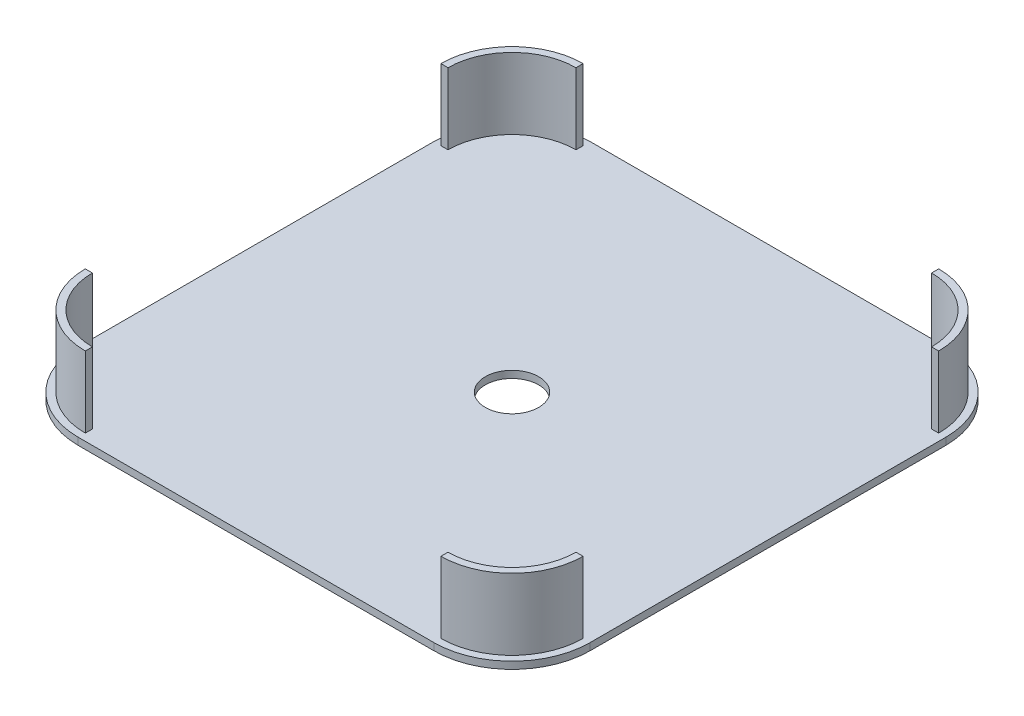
ISO-10303-21;
HEADER;
FILE_DESCRIPTION(('STEP AP214'),'2;1');
FILE_NAME('part.step','',(''),(''),'','','');
FILE_SCHEMA(('AUTOMOTIVE_DESIGN { 1 0 10303 214 1 1 1 1 }'));
ENDSEC;
DATA;
#1=APPLICATION_CONTEXT('core data for automotive mechanical design processes');
#2=APPLICATION_PROTOCOL_DEFINITION('international standard','automotive_design',2000,#1);
#3=PRODUCT_CONTEXT('',#1,'mechanical');
#4=PRODUCT('Part','Part','',(#3));
#5=PRODUCT_RELATED_PRODUCT_CATEGORY('part','',(#4));
#6=PRODUCT_DEFINITION_FORMATION('','',#4);
#7=PRODUCT_DEFINITION_CONTEXT('part definition',#1,'design');
#8=PRODUCT_DEFINITION('design','',#6,#7);
#9=PRODUCT_DEFINITION_SHAPE('','',#8);
#10=(LENGTH_UNIT() NAMED_UNIT(*) SI_UNIT(.MILLI.,.METRE.));
#11=(NAMED_UNIT(*) PLANE_ANGLE_UNIT() SI_UNIT($,.RADIAN.));
#12=(NAMED_UNIT(*) SI_UNIT($,.STERADIAN.) SOLID_ANGLE_UNIT());
#13=UNCERTAINTY_MEASURE_WITH_UNIT(LENGTH_MEASURE(1.E-05),#10,'distance_accuracy_value','');
#14=(GEOMETRIC_REPRESENTATION_CONTEXT(3) GLOBAL_UNCERTAINTY_ASSIGNED_CONTEXT((#13)) GLOBAL_UNIT_ASSIGNED_CONTEXT((#10,
#11,#12)) REPRESENTATION_CONTEXT('',''));
#15=CARTESIAN_POINT('',(0.,0.,0.));
#16=DIRECTION('',(0.,0.,1.));
#17=DIRECTION('',(1.,0.,0.));
#18=AXIS2_PLACEMENT_3D('',#15,#16,#17);
#19=CARTESIAN_POINT('',(43.3445378151261,2.,-11.1260504201681));
#20=DIRECTION('',(0.,-1.,0.));
#21=DIRECTION('',(0.,0.,-1.));
#22=AXIS2_PLACEMENT_3D('',#19,#20,#21);
#23=PLANE('',#22);
#24=CARTESIAN_POINT('',(-6.65546218487394,2.,38.8739495798319));
#25=DIRECTION('',(0.,1.,0.));
#26=DIRECTION('',(0.,0.,1.));
#27=AXIS2_PLACEMENT_3D('',#24,#25,#26);
#28=CIRCLE('',#27,7.5);
#29=CARTESIAN_POINT('',(-6.65546218487394,2.,46.3739495798319));
#30=VERTEX_POINT('',#29);
#31=EDGE_CURVE('E703',#30,#30,#28,.T.);
#32=ORIENTED_EDGE('',*,*,#31,.F.);
#33=EDGE_LOOP('',(#32));
#34=FACE_BOUND('',#33,.T.);
#35=CARTESIAN_POINT('',(43.3445378151261,2.,88.8739495798319));
#36=DIRECTION('',(0.,1.,0.));
#37=DIRECTION('',(0.,0.,1.));
#38=AXIS2_PLACEMENT_3D('',#35,#36,#37);
#39=CIRCLE('',#38,20.);
#40=CARTESIAN_POINT('',(43.344537815126,2.,108.873949579832));
#41=VERTEX_POINT('',#40);
#42=CARTESIAN_POINT('',(63.3445378151261,2.,88.8739495798319));
#43=VERTEX_POINT('',#42);
#44=EDGE_CURVE('E215',#41,#43,#39,.T.);
#45=ORIENTED_EDGE('',*,*,#44,.F.);
#46=DIRECTION('',(0.,0.,1.));
#47=VECTOR('',#46,1.);
#48=CARTESIAN_POINT('',(43.344537815126,2.,106.873949579832));
#49=LINE('',#48,#47);
#50=CARTESIAN_POINT('',(43.3445378151253,2.,106.873949579832));
#51=VERTEX_POINT('',#50);
#52=EDGE_CURVE('E228',#51,#41,#49,.T.);
#53=ORIENTED_EDGE('',*,*,#52,.F.);
#54=CARTESIAN_POINT('',(43.3445378151261,2.,88.8739495798319));
#55=DIRECTION('',(0.,-1.,0.));
#56=DIRECTION('',(0.,0.,1.));
#57=AXIS2_PLACEMENT_3D('',#54,#55,#56);
#58=CIRCLE('',#57,18.);
#59=CARTESIAN_POINT('',(61.3445378151261,2.,88.8739495798319));
#60=VERTEX_POINT('',#59);
#61=EDGE_CURVE('E237',#60,#51,#58,.T.);
#62=ORIENTED_EDGE('',*,*,#61,.F.);
#63=DIRECTION('',(-1.,0.,0.));
#64=VECTOR('',#63,1.);
#65=CARTESIAN_POINT('',(61.3445378151261,2.,88.8739495798319));
#66=LINE('',#65,#64);
#67=EDGE_CURVE('E218',#43,#60,#66,.T.);
#68=ORIENTED_EDGE('',*,*,#67,.F.);
#69=EDGE_LOOP('',(#45,#53,#62,#68));
#70=FACE_BOUND('',#69,.T.);
#71=CARTESIAN_POINT('',(-56.6554621848739,2.,-11.1260504201681));
#72=DIRECTION('',(0.,-1.,0.));
#73=DIRECTION('',(0.,0.,1.));
#74=AXIS2_PLACEMENT_3D('',#71,#72,#73);
#75=CIRCLE('',#74,18.);
#76=CARTESIAN_POINT('',(-74.6554621848739,2.,-11.126050420168));
#77=VERTEX_POINT('',#76);
#78=CARTESIAN_POINT('',(-56.6554621848738,2.,-29.1260504201681));
#79=VERTEX_POINT('',#78);
#80=EDGE_CURVE('E286',#77,#79,#75,.T.);
#81=ORIENTED_EDGE('',*,*,#80,.F.);
#82=DIRECTION('',(1.,0.,0.));
#83=VECTOR('',#82,1.);
#84=CARTESIAN_POINT('',(-76.6554621848739,2.,-11.1260504201679));
#85=LINE('',#84,#83);
#86=CARTESIAN_POINT('',(-76.6554621848739,2.,-11.1260504201669));
#87=VERTEX_POINT('',#86);
#88=EDGE_CURVE('E291',#87,#77,#85,.T.);
#89=ORIENTED_EDGE('',*,*,#88,.F.);
#90=CARTESIAN_POINT('',(-56.6554621848739,2.,-11.1260504201681));
#91=DIRECTION('',(0.,1.,0.));
#92=DIRECTION('',(0.,0.,1.));
#93=AXIS2_PLACEMENT_3D('',#90,#91,#92);
#94=CIRCLE('',#93,20.);
#95=CARTESIAN_POINT('',(-56.6554621848739,2.,-31.1260504201681));
#96=VERTEX_POINT('',#95);
#97=EDGE_CURVE('E303',#96,#87,#94,.T.);
#98=ORIENTED_EDGE('',*,*,#97,.F.);
#99=DIRECTION('',(0.,0.,-1.));
#100=VECTOR('',#99,1.);
#101=CARTESIAN_POINT('',(-56.6554621848738,2.,-31.1260504201681));
#102=LINE('',#101,#100);
#103=EDGE_CURVE('E300',#79,#96,#102,.T.);
#104=ORIENTED_EDGE('',*,*,#103,.F.);
#105=EDGE_LOOP('',(#81,#89,#98,#104));
#106=FACE_BOUND('',#105,.T.);
#107=CARTESIAN_POINT('',(43.3445378151261,2.,-11.1260504201681));
#108=DIRECTION('',(0.,1.,0.));
#109=DIRECTION('',(0.,0.,-1.));
#110=AXIS2_PLACEMENT_3D('',#107,#108,#109);
#111=CIRCLE('',#110,22.);
#112=CARTESIAN_POINT('',(65.3445378151261,2.,-11.1260504201679));
#113=VERTEX_POINT('',#112);
#114=CARTESIAN_POINT('',(43.3445378151259,2.,-33.1260504201681));
#115=VERTEX_POINT('',#114);
#116=EDGE_CURVE('E320',#113,#115,#111,.T.);
#117=ORIENTED_EDGE('',*,*,#116,.T.);
#118=DIRECTION('',(-1.,0.,0.));
#119=VECTOR('',#118,1.);
#120=CARTESIAN_POINT('',(-56.6554621848738,2.,-33.1260504201681));
#121=LINE('',#120,#119);
#122=CARTESIAN_POINT('',(-56.6554621848738,2.,-33.1260504201681));
#123=VERTEX_POINT('',#122);
#124=EDGE_CURVE('E323',#115,#123,#121,.T.);
#125=ORIENTED_EDGE('',*,*,#124,.T.);
#126=CARTESIAN_POINT('',(-56.6554621848739,2.,-11.1260504201681));
#127=DIRECTION('',(0.,1.,0.));
#128=DIRECTION('',(0.,0.,1.));
#129=AXIS2_PLACEMENT_3D('',#126,#127,#128);
#130=CIRCLE('',#129,22.);
#131=CARTESIAN_POINT('',(-78.6554621848739,2.,-11.1260504201679));
#132=VERTEX_POINT('',#131);
#133=EDGE_CURVE('E326',#123,#132,#130,.T.);
#134=ORIENTED_EDGE('',*,*,#133,.T.);
#135=DIRECTION('',(0.,0.,1.));
#136=VECTOR('',#135,1.);
#137=CARTESIAN_POINT('',(-78.6554621848739,2.,-11.1260504201679));
#138=LINE('',#137,#136);
#139=CARTESIAN_POINT('',(-78.6554621848739,2.,88.8739495798318));
#140=VERTEX_POINT('',#139);
#141=EDGE_CURVE('E328',#132,#140,#138,.T.);
#142=ORIENTED_EDGE('',*,*,#141,.T.);
#143=CARTESIAN_POINT('',(-56.6554621848739,2.,88.8739495798319));
#144=DIRECTION('',(0.,1.,0.));
#145=DIRECTION('',(0.,0.,1.));
#146=AXIS2_PLACEMENT_3D('',#143,#144,#145);
#147=CIRCLE('',#146,22.);
#148=CARTESIAN_POINT('',(-56.6554621848739,2.,110.873949579832));
#149=VERTEX_POINT('',#148);
#150=EDGE_CURVE('E330',#140,#149,#147,.T.);
#151=ORIENTED_EDGE('',*,*,#150,.T.);
#152=DIRECTION('',(1.,0.,0.));
#153=VECTOR('',#152,1.);
#154=CARTESIAN_POINT('',(-56.6554621848737,2.,110.873949579832));
#155=LINE('',#154,#153);
#156=CARTESIAN_POINT('',(43.3445378151259,2.,110.873949579832));
#157=VERTEX_POINT('',#156);
#158=EDGE_CURVE('E332',#149,#157,#155,.T.);
#159=ORIENTED_EDGE('',*,*,#158,.T.);
#160=CARTESIAN_POINT('',(43.3445378151261,2.,88.8739495798319));
#161=DIRECTION('',(0.,1.,0.));
#162=DIRECTION('',(0.,0.,1.));
#163=AXIS2_PLACEMENT_3D('',#160,#161,#162);
#164=CIRCLE('',#163,22.);
#165=CARTESIAN_POINT('',(65.3445378151261,2.,88.8739495798318));
#166=VERTEX_POINT('',#165);
#167=EDGE_CURVE('E334',#157,#166,#164,.T.);
#168=ORIENTED_EDGE('',*,*,#167,.T.);
#169=DIRECTION('',(0.,0.,-1.));
#170=VECTOR('',#169,1.);
#171=CARTESIAN_POINT('',(65.3445378151261,2.,-11.1260504201679));
#172=LINE('',#171,#170);
#173=EDGE_CURVE('E336',#166,#113,#172,.T.);
#174=ORIENTED_EDGE('',*,*,#173,.T.);
#175=EDGE_LOOP('',(#117,#125,#134,#142,#151,#159,#168,#174));
#176=FACE_BOUND('',#175,.T.);
#177=CARTESIAN_POINT('',(43.3445378151261,2.,-11.1260504201681));
#178=DIRECTION('',(0.,-1.,0.));
#179=DIRECTION('',(0.,0.,1.));
#180=AXIS2_PLACEMENT_3D('',#177,#178,#179);
#181=CIRCLE('',#180,18.);
#182=CARTESIAN_POINT('',(43.344537815126,2.,-29.1260504201681));
#183=VERTEX_POINT('',#182);
#184=CARTESIAN_POINT('',(61.3445378151261,2.,-11.1260504201679));
#185=VERTEX_POINT('',#184);
#186=EDGE_CURVE('E253',#183,#185,#181,.T.);
#187=ORIENTED_EDGE('',*,*,#186,.F.);
#188=DIRECTION('',(0.,0.,1.));
#189=VECTOR('',#188,1.);
#190=CARTESIAN_POINT('',(43.3445378151259,2.,-31.1260504201681));
#191=LINE('',#190,#189);
#192=CARTESIAN_POINT('',(43.3445378151259,2.,-31.1260504201681));
#193=VERTEX_POINT('',#192);
#194=EDGE_CURVE('E258',#193,#183,#191,.T.);
#195=ORIENTED_EDGE('',*,*,#194,.F.);
#196=CARTESIAN_POINT('',(43.3445378151261,2.,-11.1260504201681));
#197=DIRECTION('',(0.,1.,0.));
#198=DIRECTION('',(0.,0.,1.));
#199=AXIS2_PLACEMENT_3D('',#196,#197,#198);
#200=CIRCLE('',#199,20.);
#201=CARTESIAN_POINT('',(63.3445378151261,2.,-11.1260504201679));
#202=VERTEX_POINT('',#201);
#203=EDGE_CURVE('E270',#202,#193,#200,.T.);
#204=ORIENTED_EDGE('',*,*,#203,.F.);
#205=DIRECTION('',(1.,0.,0.));
#206=VECTOR('',#205,1.);
#207=CARTESIAN_POINT('',(61.3445378151261,2.,-11.1260504201679));
#208=LINE('',#207,#206);
#209=EDGE_CURVE('E267',#185,#202,#208,.T.);
#210=ORIENTED_EDGE('',*,*,#209,.F.);
#211=EDGE_LOOP('',(#187,#195,#204,#210));
#212=FACE_BOUND('',#211,.T.);
#213=CARTESIAN_POINT('',(-56.6554621848739,2.,88.8739495798319));
#214=DIRECTION('',(0.,-1.,0.));
#215=DIRECTION('',(0.,0.,1.));
#216=AXIS2_PLACEMENT_3D('',#213,#214,#215);
#217=CIRCLE('',#216,18.);
#218=CARTESIAN_POINT('',(-56.6554621848739,2.,106.873949579832));
#219=VERTEX_POINT('',#218);
#220=CARTESIAN_POINT('',(-74.6554621848739,2.,88.8739495798318));
#221=VERTEX_POINT('',#220);
#222=EDGE_CURVE('E214',#219,#221,#217,.T.);
#223=ORIENTED_EDGE('',*,*,#222,.F.);
#224=DIRECTION('',(0.,0.,-1.));
#225=VECTOR('',#224,1.);
#226=CARTESIAN_POINT('',(-56.6554621848739,2.,108.873949579832));
#227=LINE('',#226,#225);
#228=CARTESIAN_POINT('',(-56.6554621848739,2.,108.873949579832));
#229=VERTEX_POINT('',#228);
#230=EDGE_CURVE('E211',#229,#219,#227,.T.);
#231=ORIENTED_EDGE('',*,*,#230,.F.);
#232=CARTESIAN_POINT('',(-56.6554621848739,2.,88.8739495798319));
#233=DIRECTION('',(0.,1.,0.));
#234=DIRECTION('',(0.,0.,1.));
#235=AXIS2_PLACEMENT_3D('',#232,#233,#234);
#236=CIRCLE('',#235,20.);
#237=CARTESIAN_POINT('',(-76.6554621848739,2.,88.8739495798318));
#238=VERTEX_POINT('',#237);
#239=EDGE_CURVE('E53',#238,#229,#236,.T.);
#240=ORIENTED_EDGE('',*,*,#239,.F.);
#241=DIRECTION('',(-1.,0.,0.));
#242=VECTOR('',#241,1.);
#243=CARTESIAN_POINT('',(-76.6554621848739,2.,88.8739495798318));
#244=LINE('',#243,#242);
#245=EDGE_CURVE('E48',#221,#238,#244,.T.);
#246=ORIENTED_EDGE('',*,*,#245,.F.);
#247=EDGE_LOOP('',(#223,#231,#240,#246));
#248=FACE_BOUND('',#247,.T.);
#249=ADVANCED_FACE('F33',(#34,#70,#106,#176,#212,#248),#23,.F.);
#250=CARTESIAN_POINT('',(43.3445378151261,2.,-11.1260504201681));
#251=DIRECTION('',(0.,-1.,0.));
#252=DIRECTION('',(0.,0.,-1.));
#253=AXIS2_PLACEMENT_3D('',#250,#251,#252);
#254=CYLINDRICAL_SURFACE('',#253,22.);
#255=CARTESIAN_POINT('',(43.3445378151261,0.,-11.1260504201681));
#256=DIRECTION('',(0.,1.,0.));
#257=DIRECTION('',(0.,0.,-1.));
#258=AXIS2_PLACEMENT_3D('',#255,#256,#257);
#259=CIRCLE('',#258,22.);
#260=CARTESIAN_POINT('',(65.3445378151261,0.,-11.1260504201679));
#261=VERTEX_POINT('',#260);
#262=CARTESIAN_POINT('',(43.3445378151259,0.,-33.1260504201681));
#263=VERTEX_POINT('',#262);
#264=EDGE_CURVE('E319',#261,#263,#259,.T.);
#265=ORIENTED_EDGE('',*,*,#264,.T.);
#266=DIRECTION('',(0.,-1.,0.));
#267=VECTOR('',#266,1.);
#268=CARTESIAN_POINT('',(43.3445378151259,2.,-33.1260504201681));
#269=LINE('',#268,#267);
#270=EDGE_CURVE('E11',#115,#263,#269,.T.);
#271=ORIENTED_EDGE('',*,*,#270,.F.);
#272=ORIENTED_EDGE('',*,*,#116,.F.);
#273=DIRECTION('',(0.,-1.,0.));
#274=VECTOR('',#273,1.);
#275=CARTESIAN_POINT('',(65.3445378151261,2.,-11.1260504201679));
#276=LINE('',#275,#274);
#277=EDGE_CURVE('E338',#113,#261,#276,.T.);
#278=ORIENTED_EDGE('',*,*,#277,.T.);
#279=EDGE_LOOP('',(#265,#271,#272,#278));
#280=FACE_BOUND('',#279,.T.);
#281=ADVANCED_FACE('F35',(#280),#254,.T.);
#282=CARTESIAN_POINT('',(-56.6554621848738,2.,-33.1260504201681));
#283=DIRECTION('',(0.,0.,1.));
#284=DIRECTION('',(1.,0.,0.));
#285=AXIS2_PLACEMENT_3D('',#282,#283,#284);
#286=PLANE('',#285);
#287=DIRECTION('',(-1.,0.,0.));
#288=VECTOR('',#287,1.);
#289=CARTESIAN_POINT('',(-56.6554621848738,0.,-33.1260504201681));
#290=LINE('',#289,#288);
#291=CARTESIAN_POINT('',(-56.6554621848738,0.,-33.1260504201681));
#292=VERTEX_POINT('',#291);
#293=EDGE_CURVE('E341',#263,#292,#290,.T.);
#294=ORIENTED_EDGE('',*,*,#293,.T.);
#295=DIRECTION('',(0.,-1.,0.));
#296=VECTOR('',#295,1.);
#297=CARTESIAN_POINT('',(-56.6554621848738,2.,-33.1260504201681));
#298=LINE('',#297,#296);
#299=EDGE_CURVE('E41',#123,#292,#298,.T.);
#300=ORIENTED_EDGE('',*,*,#299,.F.);
#301=ORIENTED_EDGE('',*,*,#124,.F.);
#302=ORIENTED_EDGE('',*,*,#270,.T.);
#303=EDGE_LOOP('',(#294,#300,#301,#302));
#304=FACE_BOUND('',#303,.T.);
#305=ADVANCED_FACE('F398',(#304),#286,.F.);
#306=CARTESIAN_POINT('',(-56.6554621848739,2.,-11.1260504201681));
#307=DIRECTION('',(0.,-1.,0.));
#308=DIRECTION('',(0.,0.,-1.));
#309=AXIS2_PLACEMENT_3D('',#306,#307,#308);
#310=CYLINDRICAL_SURFACE('',#309,22.);
#311=CARTESIAN_POINT('',(-56.6554621848739,0.,-11.1260504201681));
#312=DIRECTION('',(0.,1.,0.));
#313=DIRECTION('',(0.,0.,1.));
#314=AXIS2_PLACEMENT_3D('',#311,#312,#313);
#315=CIRCLE('',#314,22.);
#316=CARTESIAN_POINT('',(-78.6554621848739,0.,-11.1260504201679));
#317=VERTEX_POINT('',#316);
#318=EDGE_CURVE('E343',#292,#317,#315,.T.);
#319=ORIENTED_EDGE('',*,*,#318,.T.);
#320=DIRECTION('',(0.,-1.,0.));
#321=VECTOR('',#320,1.);
#322=CARTESIAN_POINT('',(-78.6554621848739,2.,-11.1260504201679));
#323=LINE('',#322,#321);
#324=EDGE_CURVE('E368',#132,#317,#323,.T.);
#325=ORIENTED_EDGE('',*,*,#324,.F.);
#326=ORIENTED_EDGE('',*,*,#133,.F.);
#327=ORIENTED_EDGE('',*,*,#299,.T.);
#328=EDGE_LOOP('',(#319,#325,#326,#327));
#329=FACE_BOUND('',#328,.T.);
#330=ADVANCED_FACE('F375',(#329),#310,.T.);
#331=CARTESIAN_POINT('',(-78.6554621848739,2.,-11.1260504201679));
#332=DIRECTION('',(1.,0.,0.));
#333=DIRECTION('',(0.,0.,-1.));
#334=AXIS2_PLACEMENT_3D('',#331,#332,#333);
#335=PLANE('',#334);
#336=DIRECTION('',(0.,0.,1.));
#337=VECTOR('',#336,1.);
#338=CARTESIAN_POINT('',(-78.6554621848739,0.,-11.1260504201679));
#339=LINE('',#338,#337);
#340=CARTESIAN_POINT('',(-78.6554621848739,0.,88.8739495798318));
#341=VERTEX_POINT('',#340);
#342=EDGE_CURVE('E345',#317,#341,#339,.T.);
#343=ORIENTED_EDGE('',*,*,#342,.T.);
#344=DIRECTION('',(0.,-1.,0.));
#345=VECTOR('',#344,1.);
#346=CARTESIAN_POINT('',(-78.6554621848739,2.,88.8739495798318));
#347=LINE('',#346,#345);
#348=EDGE_CURVE('E365',#140,#341,#347,.T.);
#349=ORIENTED_EDGE('',*,*,#348,.F.);
#350=ORIENTED_EDGE('',*,*,#141,.F.);
#351=ORIENTED_EDGE('',*,*,#324,.T.);
#352=EDGE_LOOP('',(#343,#349,#350,#351));
#353=FACE_BOUND('',#352,.T.);
#354=ADVANCED_FACE('F386',(#353),#335,.F.);
#355=CARTESIAN_POINT('',(-56.6554621848739,2.,88.8739495798319));
#356=DIRECTION('',(0.,-1.,0.));
#357=DIRECTION('',(0.,0.,-1.));
#358=AXIS2_PLACEMENT_3D('',#355,#356,#357);
#359=CYLINDRICAL_SURFACE('',#358,22.);
#360=CARTESIAN_POINT('',(-56.6554621848739,0.,88.8739495798319));
#361=DIRECTION('',(0.,1.,0.));
#362=DIRECTION('',(0.,0.,1.));
#363=AXIS2_PLACEMENT_3D('',#360,#361,#362);
#364=CIRCLE('',#363,22.);
#365=CARTESIAN_POINT('',(-56.6554621848739,0.,110.873949579832));
#366=VERTEX_POINT('',#365);
#367=EDGE_CURVE('E347',#341,#366,#364,.T.);
#368=ORIENTED_EDGE('',*,*,#367,.T.);
#369=DIRECTION('',(0.,-1.,0.));
#370=VECTOR('',#369,1.);
#371=CARTESIAN_POINT('',(-56.6554621848739,2.,110.873949579832));
#372=LINE('',#371,#370);
#373=EDGE_CURVE('E362',#149,#366,#372,.T.);
#374=ORIENTED_EDGE('',*,*,#373,.F.);
#375=ORIENTED_EDGE('',*,*,#150,.F.);
#376=ORIENTED_EDGE('',*,*,#348,.T.);
#377=EDGE_LOOP('',(#368,#374,#375,#376));
#378=FACE_BOUND('',#377,.T.);
#379=ADVANCED_FACE('F390',(#378),#359,.T.);
#380=CARTESIAN_POINT('',(-56.6554621848737,2.,110.873949579832));
#381=DIRECTION('',(0.,0.,-1.));
#382=DIRECTION('',(-1.,0.,0.));
#383=AXIS2_PLACEMENT_3D('',#380,#381,#382);
#384=PLANE('',#383);
#385=DIRECTION('',(1.,0.,0.));
#386=VECTOR('',#385,1.);
#387=CARTESIAN_POINT('',(-56.6554621848737,0.,110.873949579832));
#388=LINE('',#387,#386);
#389=CARTESIAN_POINT('',(43.3445378151259,0.,110.873949579832));
#390=VERTEX_POINT('',#389);
#391=EDGE_CURVE('E349',#366,#390,#388,.T.);
#392=ORIENTED_EDGE('',*,*,#391,.T.);
#393=DIRECTION('',(0.,-1.,0.));
#394=VECTOR('',#393,1.);
#395=CARTESIAN_POINT('',(43.3445378151259,2.,110.873949579832));
#396=LINE('',#395,#394);
#397=EDGE_CURVE('E359',#157,#390,#396,.T.);
#398=ORIENTED_EDGE('',*,*,#397,.F.);
#399=ORIENTED_EDGE('',*,*,#158,.F.);
#400=ORIENTED_EDGE('',*,*,#373,.T.);
#401=EDGE_LOOP('',(#392,#398,#399,#400));
#402=FACE_BOUND('',#401,.T.);
#403=ADVANCED_FACE('F411',(#402),#384,.F.);
#404=CARTESIAN_POINT('',(43.3445378151261,2.,88.8739495798319));
#405=DIRECTION('',(0.,-1.,0.));
#406=DIRECTION('',(0.,0.,-1.));
#407=AXIS2_PLACEMENT_3D('',#404,#405,#406);
#408=CYLINDRICAL_SURFACE('',#407,22.);
#409=CARTESIAN_POINT('',(43.3445378151261,0.,88.8739495798319));
#410=DIRECTION('',(0.,1.,0.));
#411=DIRECTION('',(0.,0.,1.));
#412=AXIS2_PLACEMENT_3D('',#409,#410,#411);
#413=CIRCLE('',#412,22.);
#414=CARTESIAN_POINT('',(65.3445378151261,0.,88.8739495798318));
#415=VERTEX_POINT('',#414);
#416=EDGE_CURVE('E351',#390,#415,#413,.T.);
#417=ORIENTED_EDGE('',*,*,#416,.T.);
#418=DIRECTION('',(0.,-1.,0.));
#419=VECTOR('',#418,1.);
#420=CARTESIAN_POINT('',(65.3445378151261,2.,88.8739495798318));
#421=LINE('',#420,#419);
#422=EDGE_CURVE('E356',#166,#415,#421,.T.);
#423=ORIENTED_EDGE('',*,*,#422,.F.);
#424=ORIENTED_EDGE('',*,*,#167,.F.);
#425=ORIENTED_EDGE('',*,*,#397,.T.);
#426=EDGE_LOOP('',(#417,#423,#424,#425));
#427=FACE_BOUND('',#426,.T.);
#428=ADVANCED_FACE('F409',(#427),#408,.T.);
#429=CARTESIAN_POINT('',(65.3445378151261,2.,-11.1260504201679));
#430=DIRECTION('',(-1.,0.,0.));
#431=DIRECTION('',(0.,0.,1.));
#432=AXIS2_PLACEMENT_3D('',#429,#430,#431);
#433=PLANE('',#432);
#434=DIRECTION('',(0.,0.,-1.));
#435=VECTOR('',#434,1.);
#436=CARTESIAN_POINT('',(65.3445378151261,0.,-11.1260504201679));
#437=LINE('',#436,#435);
#438=EDGE_CURVE('E324',#415,#261,#437,.T.);
#439=ORIENTED_EDGE('',*,*,#438,.T.);
#440=ORIENTED_EDGE('',*,*,#277,.F.);
#441=ORIENTED_EDGE('',*,*,#173,.F.);
#442=ORIENTED_EDGE('',*,*,#422,.T.);
#443=EDGE_LOOP('',(#439,#440,#441,#442));
#444=FACE_BOUND('',#443,.T.);
#445=ADVANCED_FACE('F404',(#444),#433,.F.);
#446=CARTESIAN_POINT('',(43.3445378151261,0.,-11.1260504201681));
#447=DIRECTION('',(0.,-1.,0.));
#448=DIRECTION('',(0.,0.,-1.));
#449=AXIS2_PLACEMENT_3D('',#446,#447,#448);
#450=PLANE('',#449);
#451=CARTESIAN_POINT('',(-6.65546218487394,0.,38.8739495798319));
#452=DIRECTION('',(0.,1.,0.));
#453=DIRECTION('',(0.,0.,1.));
#454=AXIS2_PLACEMENT_3D('',#451,#452,#453);
#455=CIRCLE('',#454,7.5);
#456=CARTESIAN_POINT('',(-6.65546218487394,0.,46.3739495798319));
#457=VERTEX_POINT('',#456);
#458=EDGE_CURVE('E701',#457,#457,#455,.T.);
#459=ORIENTED_EDGE('',*,*,#458,.T.);
#460=EDGE_LOOP('',(#459));
#461=FACE_BOUND('',#460,.T.);
#462=ORIENTED_EDGE('',*,*,#264,.F.);
#463=ORIENTED_EDGE('',*,*,#438,.F.);
#464=ORIENTED_EDGE('',*,*,#416,.F.);
#465=ORIENTED_EDGE('',*,*,#391,.F.);
#466=ORIENTED_EDGE('',*,*,#367,.F.);
#467=ORIENTED_EDGE('',*,*,#342,.F.);
#468=ORIENTED_EDGE('',*,*,#318,.F.);
#469=ORIENTED_EDGE('',*,*,#293,.F.);
#470=EDGE_LOOP('',(#462,#463,#464,#465,#466,#467,#468,#469));
#471=FACE_BOUND('',#470,.T.);
#472=ADVANCED_FACE('F381',(#461,#471),#450,.T.);
#473=CARTESIAN_POINT('',(-56.6554621848739,22.,-11.1260504201681));
#474=DIRECTION('',(0.,-1.,0.));
#475=DIRECTION('',(0.,0.,-1.));
#476=AXIS2_PLACEMENT_3D('',#473,#474,#475);
#477=CYLINDRICAL_SURFACE('',#476,18.);
#478=ORIENTED_EDGE('',*,*,#80,.T.);
#479=DIRECTION('',(0.,-1.,0.));
#480=VECTOR('',#479,1.);
#481=CARTESIAN_POINT('',(-56.6554621848738,22.,-29.1260504201681));
#482=LINE('',#481,#480);
#483=CARTESIAN_POINT('',(-56.6554621848738,22.,-29.1260504201681));
#484=VERTEX_POINT('',#483);
#485=EDGE_CURVE('E316',#484,#79,#482,.T.);
#486=ORIENTED_EDGE('',*,*,#485,.F.);
#487=CARTESIAN_POINT('',(-56.6554621848739,22.,-11.1260504201681));
#488=DIRECTION('',(0.,-1.,0.));
#489=DIRECTION('',(0.,0.,1.));
#490=AXIS2_PLACEMENT_3D('',#487,#488,#489);
#491=CIRCLE('',#490,18.);
#492=CARTESIAN_POINT('',(-74.6554621848739,22.,-11.126050420168));
#493=VERTEX_POINT('',#492);
#494=EDGE_CURVE('E287',#493,#484,#491,.T.);
#495=ORIENTED_EDGE('',*,*,#494,.F.);
#496=DIRECTION('',(0.,-1.,0.));
#497=VECTOR('',#496,1.);
#498=CARTESIAN_POINT('',(-74.6554621848739,22.,-11.126050420168));
#499=LINE('',#498,#497);
#500=EDGE_CURVE('E297',#493,#77,#499,.T.);
#501=ORIENTED_EDGE('',*,*,#500,.T.);
#502=EDGE_LOOP('',(#478,#486,#495,#501));
#503=FACE_BOUND('',#502,.T.);
#504=ADVANCED_FACE('F430',(#503),#477,.F.);
#505=CARTESIAN_POINT('',(-56.6554621848738,22.,-31.1260504201681));
#506=DIRECTION('',(-1.,0.,0.));
#507=DIRECTION('',(0.,0.,1.));
#508=AXIS2_PLACEMENT_3D('',#505,#506,#507);
#509=PLANE('',#508);
#510=ORIENTED_EDGE('',*,*,#103,.T.);
#511=DIRECTION('',(0.,-1.,0.));
#512=VECTOR('',#511,1.);
#513=CARTESIAN_POINT('',(-56.6554621848738,22.,-31.1260504201681));
#514=LINE('',#513,#512);
#515=CARTESIAN_POINT('',(-56.6554621848738,22.,-31.1260504201681));
#516=VERTEX_POINT('',#515);
#517=EDGE_CURVE('E313',#516,#96,#514,.T.);
#518=ORIENTED_EDGE('',*,*,#517,.F.);
#519=DIRECTION('',(0.,0.,-1.));
#520=VECTOR('',#519,1.);
#521=CARTESIAN_POINT('',(-56.6554621848738,22.,-31.1260504201681));
#522=LINE('',#521,#520);
#523=EDGE_CURVE('E290',#484,#516,#522,.T.);
#524=ORIENTED_EDGE('',*,*,#523,.F.);
#525=ORIENTED_EDGE('',*,*,#485,.T.);
#526=EDGE_LOOP('',(#510,#518,#524,#525));
#527=FACE_BOUND('',#526,.T.);
#528=ADVANCED_FACE('F451',(#527),#509,.F.);
#529=CARTESIAN_POINT('',(-56.6554621848739,22.,-11.1260504201681));
#530=DIRECTION('',(0.,-1.,0.));
#531=DIRECTION('',(0.,0.,-1.));
#532=AXIS2_PLACEMENT_3D('',#529,#530,#531);
#533=CYLINDRICAL_SURFACE('',#532,20.);
#534=ORIENTED_EDGE('',*,*,#97,.T.);
#535=DIRECTION('',(0.,-1.,0.));
#536=VECTOR('',#535,1.);
#537=CARTESIAN_POINT('',(-76.6554621848739,22.,-11.1260504201679));
#538=LINE('',#537,#536);
#539=CARTESIAN_POINT('',(-76.6554621848739,22.,-11.1260504201679));
#540=VERTEX_POINT('',#539);
#541=EDGE_CURVE('E310',#540,#87,#538,.T.);
#542=ORIENTED_EDGE('',*,*,#541,.F.);
#543=CARTESIAN_POINT('',(-56.6554621848739,22.,-11.1260504201681));
#544=DIRECTION('',(0.,1.,0.));
#545=DIRECTION('',(0.,0.,1.));
#546=AXIS2_PLACEMENT_3D('',#543,#544,#545);
#547=CIRCLE('',#546,20.);
#548=EDGE_CURVE('E293',#516,#540,#547,.T.);
#549=ORIENTED_EDGE('',*,*,#548,.F.);
#550=ORIENTED_EDGE('',*,*,#517,.T.);
#551=EDGE_LOOP('',(#534,#542,#549,#550));
#552=FACE_BOUND('',#551,.T.);
#553=ADVANCED_FACE('F458',(#552),#533,.T.);
#554=CARTESIAN_POINT('',(-76.6554621848739,22.,-11.1260504201679));
#555=DIRECTION('',(0.,0.,-1.));
#556=DIRECTION('',(-1.,0.,0.));
#557=AXIS2_PLACEMENT_3D('',#554,#555,#556);
#558=PLANE('',#557);
#559=ORIENTED_EDGE('',*,*,#88,.T.);
#560=ORIENTED_EDGE('',*,*,#500,.F.);
#561=DIRECTION('',(1.,0.,0.));
#562=VECTOR('',#561,1.);
#563=CARTESIAN_POINT('',(-76.6554621848739,22.,-11.1260504201679));
#564=LINE('',#563,#562);
#565=EDGE_CURVE('E295',#540,#493,#564,.T.);
#566=ORIENTED_EDGE('',*,*,#565,.F.);
#567=ORIENTED_EDGE('',*,*,#541,.T.);
#568=EDGE_LOOP('',(#559,#560,#566,#567));
#569=FACE_BOUND('',#568,.T.);
#570=ADVANCED_FACE('F465',(#569),#558,.F.);
#571=CARTESIAN_POINT('',(-56.6554621848739,22.,-11.1260504201681));
#572=DIRECTION('',(0.,1.,0.));
#573=DIRECTION('',(0.,0.,1.));
#574=AXIS2_PLACEMENT_3D('',#571,#572,#573);
#575=PLANE('',#574);
#576=ORIENTED_EDGE('',*,*,#494,.T.);
#577=ORIENTED_EDGE('',*,*,#523,.T.);
#578=ORIENTED_EDGE('',*,*,#548,.T.);
#579=ORIENTED_EDGE('',*,*,#565,.T.);
#580=EDGE_LOOP('',(#576,#577,#578,#579));
#581=FACE_BOUND('',#580,.T.);
#582=ADVANCED_FACE('F473',(#581),#575,.T.);
#583=CARTESIAN_POINT('',(43.3445378151261,22.,-11.1260504201681));
#584=DIRECTION('',(0.,-1.,0.));
#585=DIRECTION('',(0.,0.,-1.));
#586=AXIS2_PLACEMENT_3D('',#583,#584,#585);
#587=CYLINDRICAL_SURFACE('',#586,18.);
#588=ORIENTED_EDGE('',*,*,#186,.T.);
#589=DIRECTION('',(0.,-1.,0.));
#590=VECTOR('',#589,1.);
#591=CARTESIAN_POINT('',(61.3445378151261,22.,-11.1260504201679));
#592=LINE('',#591,#590);
#593=CARTESIAN_POINT('',(61.3445378151261,22.,-11.1260504201679));
#594=VERTEX_POINT('',#593);
#595=EDGE_CURVE('E283',#594,#185,#592,.T.);
#596=ORIENTED_EDGE('',*,*,#595,.F.);
#597=CARTESIAN_POINT('',(43.3445378151261,22.,-11.1260504201681));
#598=DIRECTION('',(0.,-1.,0.));
#599=DIRECTION('',(0.,0.,1.));
#600=AXIS2_PLACEMENT_3D('',#597,#598,#599);
#601=CIRCLE('',#600,18.);
#602=CARTESIAN_POINT('',(43.344537815126,22.,-29.1260504201681));
#603=VERTEX_POINT('',#602);
#604=EDGE_CURVE('E254',#603,#594,#601,.T.);
#605=ORIENTED_EDGE('',*,*,#604,.F.);
#606=DIRECTION('',(0.,-1.,0.));
#607=VECTOR('',#606,1.);
#608=CARTESIAN_POINT('',(43.344537815126,22.,-29.1260504201681));
#609=LINE('',#608,#607);
#610=EDGE_CURVE('E264',#603,#183,#609,.T.);
#611=ORIENTED_EDGE('',*,*,#610,.T.);
#612=EDGE_LOOP('',(#588,#596,#605,#611));
#613=FACE_BOUND('',#612,.T.);
#614=ADVANCED_FACE('F481',(#613),#587,.F.);
#615=CARTESIAN_POINT('',(61.3445378151261,22.,-11.1260504201679));
#616=DIRECTION('',(0.,0.,-1.));
#617=DIRECTION('',(-1.,0.,0.));
#618=AXIS2_PLACEMENT_3D('',#615,#616,#617);
#619=PLANE('',#618);
#620=ORIENTED_EDGE('',*,*,#209,.T.);
#621=DIRECTION('',(0.,-1.,0.));
#622=VECTOR('',#621,1.);
#623=CARTESIAN_POINT('',(63.3445378151261,22.,-11.1260504201679));
#624=LINE('',#623,#622);
#625=CARTESIAN_POINT('',(63.3445378151261,22.,-11.1260504201679));
#626=VERTEX_POINT('',#625);
#627=EDGE_CURVE('E280',#626,#202,#624,.T.);
#628=ORIENTED_EDGE('',*,*,#627,.F.);
#629=DIRECTION('',(1.,0.,0.));
#630=VECTOR('',#629,1.);
#631=CARTESIAN_POINT('',(61.3445378151261,22.,-11.1260504201679));
#632=LINE('',#631,#630);
#633=EDGE_CURVE('E257',#594,#626,#632,.T.);
#634=ORIENTED_EDGE('',*,*,#633,.F.);
#635=ORIENTED_EDGE('',*,*,#595,.T.);
#636=EDGE_LOOP('',(#620,#628,#634,#635));
#637=FACE_BOUND('',#636,.T.);
#638=ADVANCED_FACE('F489',(#637),#619,.F.);
#639=CARTESIAN_POINT('',(43.3445378151261,22.,-11.1260504201681));
#640=DIRECTION('',(0.,-1.,0.));
#641=DIRECTION('',(0.,0.,-1.));
#642=AXIS2_PLACEMENT_3D('',#639,#640,#641);
#643=CYLINDRICAL_SURFACE('',#642,20.);
#644=ORIENTED_EDGE('',*,*,#203,.T.);
#645=DIRECTION('',(0.,-1.,0.));
#646=VECTOR('',#645,1.);
#647=CARTESIAN_POINT('',(43.3445378151259,22.,-31.1260504201681));
#648=LINE('',#647,#646);
#649=CARTESIAN_POINT('',(43.3445378151259,22.,-31.1260504201681));
#650=VERTEX_POINT('',#649);
#651=EDGE_CURVE('E277',#650,#193,#648,.T.);
#652=ORIENTED_EDGE('',*,*,#651,.F.);
#653=CARTESIAN_POINT('',(43.3445378151261,22.,-11.1260504201681));
#654=DIRECTION('',(0.,1.,0.));
#655=DIRECTION('',(0.,0.,1.));
#656=AXIS2_PLACEMENT_3D('',#653,#654,#655);
#657=CIRCLE('',#656,20.);
#658=EDGE_CURVE('E260',#626,#650,#657,.T.);
#659=ORIENTED_EDGE('',*,*,#658,.F.);
#660=ORIENTED_EDGE('',*,*,#627,.T.);
#661=EDGE_LOOP('',(#644,#652,#659,#660));
#662=FACE_BOUND('',#661,.T.);
#663=ADVANCED_FACE('F497',(#662),#643,.T.);
#664=CARTESIAN_POINT('',(43.3445378151259,22.,-31.1260504201681));
#665=DIRECTION('',(1.,0.,0.));
#666=DIRECTION('',(0.,0.,-1.));
#667=AXIS2_PLACEMENT_3D('',#664,#665,#666);
#668=PLANE('',#667);
#669=ORIENTED_EDGE('',*,*,#194,.T.);
#670=ORIENTED_EDGE('',*,*,#610,.F.);
#671=DIRECTION('',(0.,0.,1.));
#672=VECTOR('',#671,1.);
#673=CARTESIAN_POINT('',(43.3445378151259,22.,-31.1260504201681));
#674=LINE('',#673,#672);
#675=EDGE_CURVE('E262',#650,#603,#674,.T.);
#676=ORIENTED_EDGE('',*,*,#675,.F.);
#677=ORIENTED_EDGE('',*,*,#651,.T.);
#678=EDGE_LOOP('',(#669,#670,#676,#677));
#679=FACE_BOUND('',#678,.T.);
#680=ADVANCED_FACE('F505',(#679),#668,.F.);
#681=CARTESIAN_POINT('',(43.3445378151261,22.,-11.1260504201681));
#682=DIRECTION('',(0.,1.,0.));
#683=DIRECTION('',(0.,0.,1.));
#684=AXIS2_PLACEMENT_3D('',#681,#682,#683);
#685=PLANE('',#684);
#686=ORIENTED_EDGE('',*,*,#604,.T.);
#687=ORIENTED_EDGE('',*,*,#633,.T.);
#688=ORIENTED_EDGE('',*,*,#658,.T.);
#689=ORIENTED_EDGE('',*,*,#675,.T.);
#690=EDGE_LOOP('',(#686,#687,#688,#689));
#691=FACE_BOUND('',#690,.T.);
#692=ADVANCED_FACE('F513',(#691),#685,.T.);
#693=CARTESIAN_POINT('',(43.3445378151261,22.,88.8739495798319));
#694=DIRECTION('',(0.,-1.,0.));
#695=DIRECTION('',(0.,0.,-1.));
#696=AXIS2_PLACEMENT_3D('',#693,#694,#695);
#697=CYLINDRICAL_SURFACE('',#696,20.);
#698=ORIENTED_EDGE('',*,*,#44,.T.);
#699=DIRECTION('',(0.,-1.,0.));
#700=VECTOR('',#699,1.);
#701=CARTESIAN_POINT('',(63.3445378151261,22.,88.8739495798319));
#702=LINE('',#701,#700);
#703=CARTESIAN_POINT('',(63.3445378151261,22.,88.8739495798319));
#704=VERTEX_POINT('',#703);
#705=EDGE_CURVE('E250',#704,#43,#702,.T.);
#706=ORIENTED_EDGE('',*,*,#705,.F.);
#707=CARTESIAN_POINT('',(43.3445378151261,22.,88.8739495798319));
#708=DIRECTION('',(0.,1.,0.));
#709=DIRECTION('',(0.,0.,1.));
#710=AXIS2_PLACEMENT_3D('',#707,#708,#709);
#711=CIRCLE('',#710,20.);
#712=CARTESIAN_POINT('',(43.344537815126,22.,108.873949579832));
#713=VERTEX_POINT('',#712);
#714=EDGE_CURVE('E224',#713,#704,#711,.T.);
#715=ORIENTED_EDGE('',*,*,#714,.F.);
#716=DIRECTION('',(0.,-1.,0.));
#717=VECTOR('',#716,1.);
#718=CARTESIAN_POINT('',(43.344537815126,22.,108.873949579832));
#719=LINE('',#718,#717);
#720=EDGE_CURVE('E233',#713,#41,#719,.T.);
#721=ORIENTED_EDGE('',*,*,#720,.T.);
#722=EDGE_LOOP('',(#698,#706,#715,#721));
#723=FACE_BOUND('',#722,.T.);
#724=ADVANCED_FACE('F521',(#723),#697,.T.);
#725=CARTESIAN_POINT('',(61.3445378151261,22.,88.8739495798319));
#726=DIRECTION('',(0.,0.,1.));
#727=DIRECTION('',(1.,0.,0.));
#728=AXIS2_PLACEMENT_3D('',#725,#726,#727);
#729=PLANE('',#728);
#730=ORIENTED_EDGE('',*,*,#67,.T.);
#731=DIRECTION('',(0.,-1.,0.));
#732=VECTOR('',#731,1.);
#733=CARTESIAN_POINT('',(61.3445378151261,22.,88.8739495798319));
#734=LINE('',#733,#732);
#735=CARTESIAN_POINT('',(61.3445378151261,22.,88.8739495798319));
#736=VERTEX_POINT('',#735);
#737=EDGE_CURVE('E247',#736,#60,#734,.T.);
#738=ORIENTED_EDGE('',*,*,#737,.F.);
#739=DIRECTION('',(-1.,0.,0.));
#740=VECTOR('',#739,1.);
#741=CARTESIAN_POINT('',(61.3445378151261,22.,88.8739495798319));
#742=LINE('',#741,#740);
#743=EDGE_CURVE('E227',#704,#736,#742,.T.);
#744=ORIENTED_EDGE('',*,*,#743,.F.);
#745=ORIENTED_EDGE('',*,*,#705,.T.);
#746=EDGE_LOOP('',(#730,#738,#744,#745));
#747=FACE_BOUND('',#746,.T.);
#748=ADVANCED_FACE('F529',(#747),#729,.F.);
#749=CARTESIAN_POINT('',(43.3445378151261,22.,88.8739495798319));
#750=DIRECTION('',(0.,-1.,0.));
#751=DIRECTION('',(0.,0.,-1.));
#752=AXIS2_PLACEMENT_3D('',#749,#750,#751);
#753=CYLINDRICAL_SURFACE('',#752,18.);
#754=ORIENTED_EDGE('',*,*,#61,.T.);
#755=DIRECTION('',(0.,-1.,0.));
#756=VECTOR('',#755,1.);
#757=CARTESIAN_POINT('',(43.344537815126,22.,106.873949579832));
#758=LINE('',#757,#756);
#759=CARTESIAN_POINT('',(43.344537815126,22.,106.873949579832));
#760=VERTEX_POINT('',#759);
#761=EDGE_CURVE('E244',#760,#51,#758,.T.);
#762=ORIENTED_EDGE('',*,*,#761,.F.);
#763=CARTESIAN_POINT('',(43.3445378151261,22.,88.8739495798319));
#764=DIRECTION('',(0.,-1.,0.));
#765=DIRECTION('',(0.,0.,1.));
#766=AXIS2_PLACEMENT_3D('',#763,#764,#765);
#767=CIRCLE('',#766,18.);
#768=EDGE_CURVE('E230',#736,#760,#767,.T.);
#769=ORIENTED_EDGE('',*,*,#768,.F.);
#770=ORIENTED_EDGE('',*,*,#737,.T.);
#771=EDGE_LOOP('',(#754,#762,#769,#770));
#772=FACE_BOUND('',#771,.T.);
#773=ADVANCED_FACE('F537',(#772),#753,.F.);
#774=CARTESIAN_POINT('',(43.344537815126,22.,106.873949579832));
#775=DIRECTION('',(1.,0.,0.));
#776=DIRECTION('',(0.,0.,-1.));
#777=AXIS2_PLACEMENT_3D('',#774,#775,#776);
#778=PLANE('',#777);
#779=ORIENTED_EDGE('',*,*,#52,.T.);
#780=ORIENTED_EDGE('',*,*,#720,.F.);
#781=DIRECTION('',(0.,0.,1.));
#782=VECTOR('',#781,1.);
#783=CARTESIAN_POINT('',(43.344537815126,22.,106.873949579832));
#784=LINE('',#783,#782);
#785=EDGE_CURVE('E232',#760,#713,#784,.T.);
#786=ORIENTED_EDGE('',*,*,#785,.F.);
#787=ORIENTED_EDGE('',*,*,#761,.T.);
#788=EDGE_LOOP('',(#779,#780,#786,#787));
#789=FACE_BOUND('',#788,.T.);
#790=ADVANCED_FACE('F545',(#789),#778,.F.);
#791=CARTESIAN_POINT('',(43.3445378151261,22.,88.8739495798319));
#792=DIRECTION('',(0.,1.,0.));
#793=DIRECTION('',(0.,0.,1.));
#794=AXIS2_PLACEMENT_3D('',#791,#792,#793);
#795=PLANE('',#794);
#796=ORIENTED_EDGE('',*,*,#714,.T.);
#797=ORIENTED_EDGE('',*,*,#743,.T.);
#798=ORIENTED_EDGE('',*,*,#768,.T.);
#799=ORIENTED_EDGE('',*,*,#785,.T.);
#800=EDGE_LOOP('',(#796,#797,#798,#799));
#801=FACE_BOUND('',#800,.T.);
#802=ADVANCED_FACE('F553',(#801),#795,.T.);
#803=CARTESIAN_POINT('',(-56.6554621848739,22.,88.8739495798319));
#804=DIRECTION('',(0.,-1.,0.));
#805=DIRECTION('',(0.,0.,-1.));
#806=AXIS2_PLACEMENT_3D('',#803,#804,#805);
#807=CYLINDRICAL_SURFACE('',#806,18.);
#808=ORIENTED_EDGE('',*,*,#222,.T.);
#809=DIRECTION('',(0.,-1.,0.));
#810=VECTOR('',#809,1.);
#811=CARTESIAN_POINT('',(-74.6554621848739,22.,88.8739495798318));
#812=LINE('',#811,#810);
#813=CARTESIAN_POINT('',(-74.6554621848739,22.,88.8739495798318));
#814=VERTEX_POINT('',#813);
#815=EDGE_CURVE('E195',#814,#221,#812,.T.);
#816=ORIENTED_EDGE('',*,*,#815,.F.);
#817=CARTESIAN_POINT('',(-56.6554621848739,22.,88.8739495798319));
#818=DIRECTION('',(0.,-1.,0.));
#819=DIRECTION('',(0.,0.,1.));
#820=AXIS2_PLACEMENT_3D('',#817,#818,#819);
#821=CIRCLE('',#820,18.);
#822=CARTESIAN_POINT('',(-56.6554621848739,22.,106.873949579832));
#823=VERTEX_POINT('',#822);
#824=EDGE_CURVE('E202',#823,#814,#821,.T.);
#825=ORIENTED_EDGE('',*,*,#824,.F.);
#826=DIRECTION('',(0.,-1.,0.));
#827=VECTOR('',#826,1.);
#828=CARTESIAN_POINT('',(-56.6554621848739,22.,106.873949579832));
#829=LINE('',#828,#827);
#830=EDGE_CURVE('E709',#823,#219,#829,.T.);
#831=ORIENTED_EDGE('',*,*,#830,.T.);
#832=EDGE_LOOP('',(#808,#816,#825,#831));
#833=FACE_BOUND('',#832,.T.);
#834=ADVANCED_FACE('F213',(#833),#807,.F.);
#835=CARTESIAN_POINT('',(-76.6554621848739,22.,88.8739495798318));
#836=DIRECTION('',(0.,0.,1.));
#837=DIRECTION('',(1.,0.,0.));
#838=AXIS2_PLACEMENT_3D('',#835,#836,#837);
#839=PLANE('',#838);
#840=ORIENTED_EDGE('',*,*,#245,.T.);
#841=DIRECTION('',(0.,-1.,0.));
#842=VECTOR('',#841,1.);
#843=CARTESIAN_POINT('',(-76.6554621848739,22.,88.8739495798318));
#844=LINE('',#843,#842);
#845=CARTESIAN_POINT('',(-76.6554621848739,22.,88.8739495798318));
#846=VERTEX_POINT('',#845);
#847=EDGE_CURVE('E198',#846,#238,#844,.T.);
#848=ORIENTED_EDGE('',*,*,#847,.F.);
#849=DIRECTION('',(-1.,0.,0.));
#850=VECTOR('',#849,1.);
#851=CARTESIAN_POINT('',(-76.6554621848739,22.,88.8739495798318));
#852=LINE('',#851,#850);
#853=EDGE_CURVE('E191',#814,#846,#852,.T.);
#854=ORIENTED_EDGE('',*,*,#853,.F.);
#855=ORIENTED_EDGE('',*,*,#815,.T.);
#856=EDGE_LOOP('',(#840,#848,#854,#855));
#857=FACE_BOUND('',#856,.T.);
#858=ADVANCED_FACE('F193',(#857),#839,.F.);
#859=CARTESIAN_POINT('',(-56.6554621848739,22.,88.8739495798319));
#860=DIRECTION('',(0.,-1.,0.));
#861=DIRECTION('',(0.,0.,-1.));
#862=AXIS2_PLACEMENT_3D('',#859,#860,#861);
#863=CYLINDRICAL_SURFACE('',#862,20.);
#864=ORIENTED_EDGE('',*,*,#239,.T.);
#865=DIRECTION('',(0.,-1.,0.));
#866=VECTOR('',#865,1.);
#867=CARTESIAN_POINT('',(-56.6554621848739,22.,108.873949579832));
#868=LINE('',#867,#866);
#869=CARTESIAN_POINT('',(-56.6554621848739,22.,108.873949579832));
#870=VERTEX_POINT('',#869);
#871=EDGE_CURVE('E220',#870,#229,#868,.T.);
#872=ORIENTED_EDGE('',*,*,#871,.F.);
#873=CARTESIAN_POINT('',(-56.6554621848739,22.,88.8739495798319));
#874=DIRECTION('',(0.,1.,0.));
#875=DIRECTION('',(0.,0.,1.));
#876=AXIS2_PLACEMENT_3D('',#873,#874,#875);
#877=CIRCLE('',#876,20.);
#878=EDGE_CURVE('E201',#846,#870,#877,.T.);
#879=ORIENTED_EDGE('',*,*,#878,.F.);
#880=ORIENTED_EDGE('',*,*,#847,.T.);
#881=EDGE_LOOP('',(#864,#872,#879,#880));
#882=FACE_BOUND('',#881,.T.);
#883=ADVANCED_FACE('F574',(#882),#863,.T.);
#884=CARTESIAN_POINT('',(-56.6554621848739,22.,108.873949579832));
#885=DIRECTION('',(-1.,0.,0.));
#886=DIRECTION('',(0.,0.,1.));
#887=AXIS2_PLACEMENT_3D('',#884,#885,#886);
#888=PLANE('',#887);
#889=ORIENTED_EDGE('',*,*,#230,.T.);
#890=ORIENTED_EDGE('',*,*,#830,.F.);
#891=DIRECTION('',(0.,0.,-1.));
#892=VECTOR('',#891,1.);
#893=CARTESIAN_POINT('',(-56.6554621848739,22.,108.873949579832));
#894=LINE('',#893,#892);
#895=EDGE_CURVE('E207',#870,#823,#894,.T.);
#896=ORIENTED_EDGE('',*,*,#895,.F.);
#897=ORIENTED_EDGE('',*,*,#871,.T.);
#898=EDGE_LOOP('',(#889,#890,#896,#897));
#899=FACE_BOUND('',#898,.T.);
#900=ADVANCED_FACE('F581',(#899),#888,.F.);
#901=CARTESIAN_POINT('',(-56.6554621848739,22.,88.8739495798319));
#902=DIRECTION('',(0.,1.,0.));
#903=DIRECTION('',(0.,0.,1.));
#904=AXIS2_PLACEMENT_3D('',#901,#902,#903);
#905=PLANE('',#904);
#906=ORIENTED_EDGE('',*,*,#824,.T.);
#907=ORIENTED_EDGE('',*,*,#853,.T.);
#908=ORIENTED_EDGE('',*,*,#878,.T.);
#909=ORIENTED_EDGE('',*,*,#895,.T.);
#910=EDGE_LOOP('',(#906,#907,#908,#909));
#911=FACE_BOUND('',#910,.T.);
#912=ADVANCED_FACE('F205',(#911),#905,.T.);
#913=CARTESIAN_POINT('',(-6.65546218487394,0.,38.8739495798319));
#914=DIRECTION('',(0.,1.,0.));
#915=DIRECTION('',(0.,0.,1.));
#916=AXIS2_PLACEMENT_3D('',#913,#914,#915);
#917=CYLINDRICAL_SURFACE('',#916,7.5);
#918=ORIENTED_EDGE('',*,*,#458,.F.);
#919=EDGE_LOOP('',(#918));
#920=FACE_BOUND('',#919,.T.);
#921=ORIENTED_EDGE('',*,*,#31,.T.);
#922=EDGE_LOOP('',(#921));
#923=FACE_BOUND('',#922,.T.);
#924=ADVANCED_FACE('F596',(#920,#923),#917,.F.);
#925=CLOSED_SHELL('',(#249,#281,#305,#330,#354,#379,#403,#428,#445,#472,#504,#528,#553,#570,
#582,#614,#638,#663,#680,#692,#724,#748,#773,#790,#802,#834,#858,#883,#900,#912,#924));
#926=MANIFOLD_SOLID_BREP('B2',#925);
#927=ADVANCED_BREP_SHAPE_REPRESENTATION('',(#18,#926),#14);
#928=SHAPE_DEFINITION_REPRESENTATION(#9,#927);
ENDSEC;
END-ISO-10303-21;
